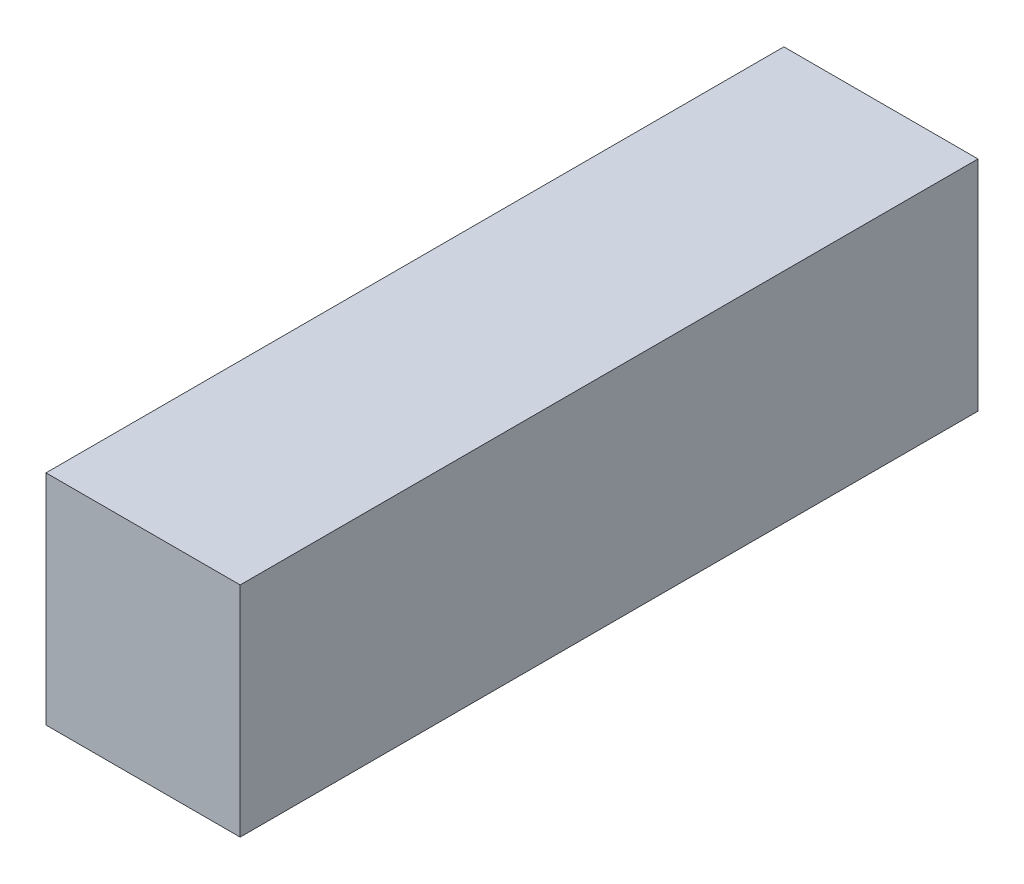
ISO-10303-21;
HEADER;
FILE_DESCRIPTION(('STEP AP214'),'2;1');
FILE_NAME('part.step','',(''),(''),'','','');
FILE_SCHEMA(('AUTOMOTIVE_DESIGN { 1 0 10303 214 1 1 1 1 }'));
ENDSEC;
DATA;
#1=APPLICATION_CONTEXT('core data for automotive mechanical design processes');
#2=APPLICATION_PROTOCOL_DEFINITION('international standard','automotive_design',2000,#1);
#3=PRODUCT_CONTEXT('',#1,'mechanical');
#4=PRODUCT('Part','Part','',(#3));
#5=PRODUCT_RELATED_PRODUCT_CATEGORY('part','',(#4));
#6=PRODUCT_DEFINITION_FORMATION('','',#4);
#7=PRODUCT_DEFINITION_CONTEXT('part definition',#1,'design');
#8=PRODUCT_DEFINITION('design','',#6,#7);
#9=PRODUCT_DEFINITION_SHAPE('','',#8);
#10=(LENGTH_UNIT() NAMED_UNIT(*) SI_UNIT(.MILLI.,.METRE.));
#11=(NAMED_UNIT(*) PLANE_ANGLE_UNIT() SI_UNIT($,.RADIAN.));
#12=(NAMED_UNIT(*) SI_UNIT($,.STERADIAN.) SOLID_ANGLE_UNIT());
#13=UNCERTAINTY_MEASURE_WITH_UNIT(LENGTH_MEASURE(1.E-05),#10,'distance_accuracy_value','');
#14=(GEOMETRIC_REPRESENTATION_CONTEXT(3) GLOBAL_UNCERTAINTY_ASSIGNED_CONTEXT((#13)) GLOBAL_UNIT_ASSIGNED_CONTEXT((#10,
#11,#12)) REPRESENTATION_CONTEXT('',''));
#15=CARTESIAN_POINT('',(0.,0.,0.));
#16=DIRECTION('',(0.,0.,1.));
#17=DIRECTION('',(1.,0.,0.));
#18=AXIS2_PLACEMENT_3D('',#15,#16,#17);
#19=CARTESIAN_POINT('',(12.7,0.,0.));
#20=DIRECTION('',(0.,0.,-1.));
#21=DIRECTION('',(-1.,0.,0.));
#22=AXIS2_PLACEMENT_3D('',#19,#20,#21);
#23=PLANE('',#22);
#24=DIRECTION('',(0.,-1.,0.));
#25=VECTOR('',#24,1.);
#26=CARTESIAN_POINT('',(0.,0.,0.));
#27=LINE('',#26,#25);
#28=CARTESIAN_POINT('',(0.,14.2875,0.));
#29=VERTEX_POINT('',#28);
#30=CARTESIAN_POINT('',(0.,0.,0.));
#31=VERTEX_POINT('',#30);
#32=EDGE_CURVE('E107',#29,#31,#27,.T.);
#33=ORIENTED_EDGE('',*,*,#32,.T.);
#34=DIRECTION('',(-1.,0.,0.));
#35=VECTOR('',#34,1.);
#36=CARTESIAN_POINT('',(12.7,0.,0.));
#37=LINE('',#36,#35);
#38=CARTESIAN_POINT('',(12.7,0.,0.));
#39=VERTEX_POINT('',#38);
#40=EDGE_CURVE('E11',#39,#31,#37,.T.);
#41=ORIENTED_EDGE('',*,*,#40,.F.);
#42=DIRECTION('',(0.,-1.,0.));
#43=VECTOR('',#42,1.);
#44=CARTESIAN_POINT('',(12.7,0.,0.));
#45=LINE('',#44,#43);
#46=CARTESIAN_POINT('',(12.7,14.2875,0.));
#47=VERTEX_POINT('',#46);
#48=EDGE_CURVE('E91',#47,#39,#45,.T.);
#49=ORIENTED_EDGE('',*,*,#48,.F.);
#50=DIRECTION('',(-1.,0.,0.));
#51=VECTOR('',#50,1.);
#52=CARTESIAN_POINT('',(12.7,14.2875,0.));
#53=LINE('',#52,#51);
#54=EDGE_CURVE('E103',#47,#29,#53,.T.);
#55=ORIENTED_EDGE('',*,*,#54,.T.);
#56=EDGE_LOOP('',(#33,#41,#49,#55));
#57=FACE_BOUND('',#56,.T.);
#58=ADVANCED_FACE('F39',(#57),#23,.F.);
#59=CARTESIAN_POINT('',(12.7,0.,0.));
#60=DIRECTION('',(0.,1.,0.));
#61=DIRECTION('',(0.,0.,1.));
#62=AXIS2_PLACEMENT_3D('',#59,#60,#61);
#63=PLANE('',#62);
#64=DIRECTION('',(0.,0.,-1.));
#65=VECTOR('',#64,1.);
#66=CARTESIAN_POINT('',(0.,0.,0.));
#67=LINE('',#66,#65);
#68=CARTESIAN_POINT('',(0.,0.,-48.26));
#69=VERTEX_POINT('',#68);
#70=EDGE_CURVE('E96',#31,#69,#67,.T.);
#71=ORIENTED_EDGE('',*,*,#70,.T.);
#72=DIRECTION('',(-1.,0.,0.));
#73=VECTOR('',#72,1.);
#74=CARTESIAN_POINT('',(12.7,0.,-48.26));
#75=LINE('',#74,#73);
#76=CARTESIAN_POINT('',(12.7,0.,-48.26));
#77=VERTEX_POINT('',#76);
#78=EDGE_CURVE('E48',#77,#69,#75,.T.);
#79=ORIENTED_EDGE('',*,*,#78,.F.);
#80=DIRECTION('',(0.,0.,-1.));
#81=VECTOR('',#80,1.);
#82=CARTESIAN_POINT('',(12.7,0.,0.));
#83=LINE('',#82,#81);
#84=EDGE_CURVE('E86',#39,#77,#83,.T.);
#85=ORIENTED_EDGE('',*,*,#84,.F.);
#86=ORIENTED_EDGE('',*,*,#40,.T.);
#87=EDGE_LOOP('',(#71,#79,#85,#86));
#88=FACE_BOUND('',#87,.T.);
#89=ADVANCED_FACE('F95',(#88),#63,.F.);
#90=CARTESIAN_POINT('',(12.7,0.,-48.26));
#91=DIRECTION('',(0.,0.,1.));
#92=DIRECTION('',(1.,0.,0.));
#93=AXIS2_PLACEMENT_3D('',#90,#91,#92);
#94=PLANE('',#93);
#95=DIRECTION('',(0.,1.,0.));
#96=VECTOR('',#95,1.);
#97=CARTESIAN_POINT('',(0.,0.,-48.26));
#98=LINE('',#97,#96);
#99=CARTESIAN_POINT('',(0.,14.2875,-48.26));
#100=VERTEX_POINT('',#99);
#101=EDGE_CURVE('E73',#69,#100,#98,.T.);
#102=ORIENTED_EDGE('',*,*,#101,.T.);
#103=DIRECTION('',(-1.,0.,0.));
#104=VECTOR('',#103,1.);
#105=CARTESIAN_POINT('',(12.7,14.2875,-48.26));
#106=LINE('',#105,#104);
#107=CARTESIAN_POINT('',(12.7,14.2875,-48.26));
#108=VERTEX_POINT('',#107);
#109=EDGE_CURVE('E98',#108,#100,#106,.T.);
#110=ORIENTED_EDGE('',*,*,#109,.F.);
#111=DIRECTION('',(0.,1.,0.));
#112=VECTOR('',#111,1.);
#113=CARTESIAN_POINT('',(12.7,0.,-48.26));
#114=LINE('',#113,#112);
#115=EDGE_CURVE('E89',#77,#108,#114,.T.);
#116=ORIENTED_EDGE('',*,*,#115,.F.);
#117=ORIENTED_EDGE('',*,*,#78,.T.);
#118=EDGE_LOOP('',(#102,#110,#116,#117));
#119=FACE_BOUND('',#118,.T.);
#120=ADVANCED_FACE('F99',(#119),#94,.F.);
#121=CARTESIAN_POINT('',(12.7,14.2875,0.));
#122=DIRECTION('',(0.,-1.,0.));
#123=DIRECTION('',(0.,0.,-1.));
#124=AXIS2_PLACEMENT_3D('',#121,#122,#123);
#125=PLANE('',#124);
#126=DIRECTION('',(0.,0.,1.));
#127=VECTOR('',#126,1.);
#128=CARTESIAN_POINT('',(0.,14.2875,0.));
#129=LINE('',#128,#127);
#130=EDGE_CURVE('E79',#100,#29,#129,.T.);
#131=ORIENTED_EDGE('',*,*,#130,.T.);
#132=ORIENTED_EDGE('',*,*,#54,.F.);
#133=DIRECTION('',(0.,0.,1.));
#134=VECTOR('',#133,1.);
#135=CARTESIAN_POINT('',(12.7,14.2875,0.));
#136=LINE('',#135,#134);
#137=EDGE_CURVE('E56',#108,#47,#136,.T.);
#138=ORIENTED_EDGE('',*,*,#137,.F.);
#139=ORIENTED_EDGE('',*,*,#109,.T.);
#140=EDGE_LOOP('',(#131,#132,#138,#139));
#141=FACE_BOUND('',#140,.T.);
#142=ADVANCED_FACE('F120',(#141),#125,.F.);
#143=CARTESIAN_POINT('',(12.7,0.,0.));
#144=DIRECTION('',(-1.,0.,0.));
#145=DIRECTION('',(0.,0.,1.));
#146=AXIS2_PLACEMENT_3D('',#143,#144,#145);
#147=PLANE('',#146);
#148=ORIENTED_EDGE('',*,*,#48,.T.);
#149=ORIENTED_EDGE('',*,*,#84,.T.);
#150=ORIENTED_EDGE('',*,*,#115,.T.);
#151=ORIENTED_EDGE('',*,*,#137,.T.);
#152=EDGE_LOOP('',(#148,#149,#150,#151));
#153=FACE_BOUND('',#152,.T.);
#154=ADVANCED_FACE('F87',(#153),#147,.F.);
#155=CARTESIAN_POINT('',(0.,0.,0.));
#156=DIRECTION('',(-1.,0.,0.));
#157=DIRECTION('',(0.,0.,1.));
#158=AXIS2_PLACEMENT_3D('',#155,#156,#157);
#159=PLANE('',#158);
#160=ORIENTED_EDGE('',*,*,#32,.F.);
#161=ORIENTED_EDGE('',*,*,#130,.F.);
#162=ORIENTED_EDGE('',*,*,#101,.F.);
#163=ORIENTED_EDGE('',*,*,#70,.F.);
#164=EDGE_LOOP('',(#160,#161,#162,#163));
#165=FACE_BOUND('',#164,.T.);
#166=ADVANCED_FACE('F123',(#165),#159,.T.);
#167=CLOSED_SHELL('',(#58,#89,#120,#142,#154,#166));
#168=MANIFOLD_SOLID_BREP('B2',#167);
#169=ADVANCED_BREP_SHAPE_REPRESENTATION('',(#18,#168),#14);
#170=SHAPE_DEFINITION_REPRESENTATION(#9,#169);
ENDSEC;
END-ISO-10303-21;
